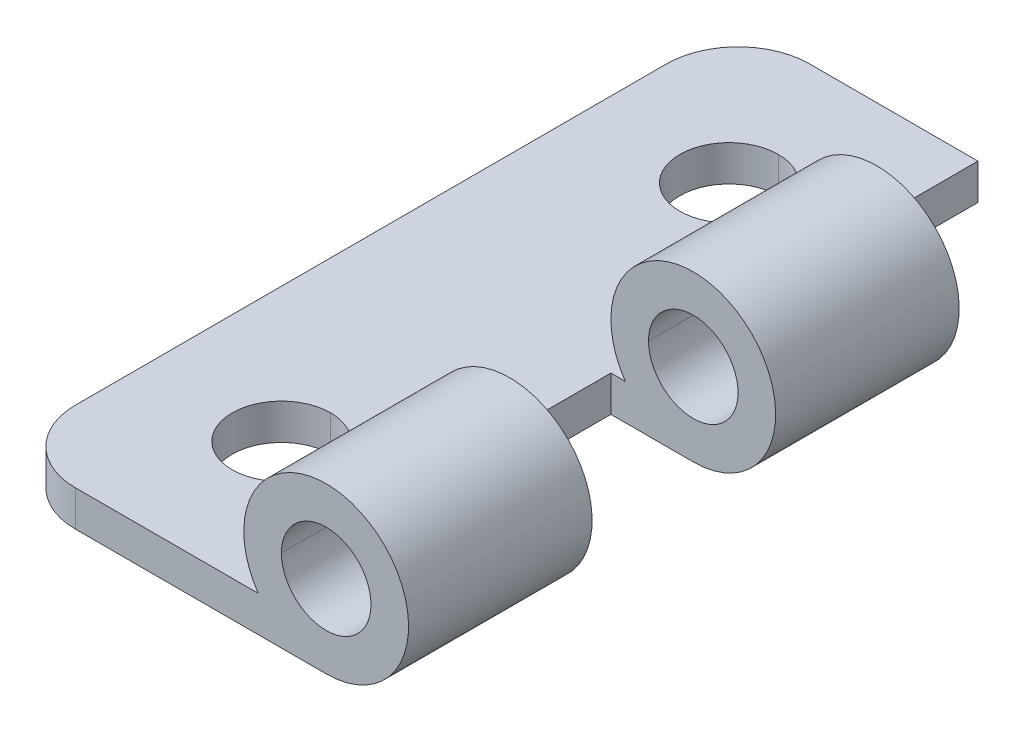
ISO-10303-21;
HEADER;
FILE_DESCRIPTION(('STEP AP214'),'2;1');
FILE_NAME('part.step','',(''),(''),'','','');
FILE_SCHEMA(('AUTOMOTIVE_DESIGN { 1 0 10303 214 1 1 1 1 }'));
ENDSEC;
DATA;
#1=APPLICATION_CONTEXT('core data for automotive mechanical design processes');
#2=APPLICATION_PROTOCOL_DEFINITION('international standard','automotive_design',2000,#1);
#3=PRODUCT_CONTEXT('',#1,'mechanical');
#4=PRODUCT('Part','Part','',(#3));
#5=PRODUCT_RELATED_PRODUCT_CATEGORY('part','',(#4));
#6=PRODUCT_DEFINITION_FORMATION('','',#4);
#7=PRODUCT_DEFINITION_CONTEXT('part definition',#1,'design');
#8=PRODUCT_DEFINITION('design','',#6,#7);
#9=PRODUCT_DEFINITION_SHAPE('','',#8);
#10=(LENGTH_UNIT() NAMED_UNIT(*) SI_UNIT(.MILLI.,.METRE.));
#11=(NAMED_UNIT(*) PLANE_ANGLE_UNIT() SI_UNIT($,.RADIAN.));
#12=(NAMED_UNIT(*) SI_UNIT($,.STERADIAN.) SOLID_ANGLE_UNIT());
#13=UNCERTAINTY_MEASURE_WITH_UNIT(LENGTH_MEASURE(1.E-05),#10,'distance_accuracy_value','');
#14=(GEOMETRIC_REPRESENTATION_CONTEXT(3) GLOBAL_UNCERTAINTY_ASSIGNED_CONTEXT((#13)) GLOBAL_UNIT_ASSIGNED_CONTEXT((#10,
#11,#12)) REPRESENTATION_CONTEXT('',''));
#15=CARTESIAN_POINT('',(0.,0.,0.));
#16=DIRECTION('',(0.,0.,1.));
#17=DIRECTION('',(1.,0.,0.));
#18=AXIS2_PLACEMENT_3D('',#15,#16,#17);
#19=CARTESIAN_POINT('',(-3.7947331922021,-2.6,41.));
#20=DIRECTION('',(0.,-1.,0.));
#21=DIRECTION('',(0.,0.,-1.));
#22=AXIS2_PLACEMENT_3D('',#19,#20,#21);
#23=PLANE('',#22);
#24=CARTESIAN_POINT('',(-10.5,-2.6,8.));
#25=DIRECTION('',(0.,1.,0.));
#26=DIRECTION('',(1.,0.,0.));
#27=AXIS2_PLACEMENT_3D('',#24,#25,#26);
#28=CIRCLE('',#27,2.75);
#29=CARTESIAN_POINT('',(-10.5,-2.6,5.25));
#30=VERTEX_POINT('',#29);
#31=CARTESIAN_POINT('',(-10.5,-2.6,10.75));
#32=VERTEX_POINT('',#31);
#33=EDGE_CURVE('E10',#30,#32,#28,.T.);
#34=ORIENTED_EDGE('',*,*,#33,.F.);
#35=CARTESIAN_POINT('',(-10.5,-2.6,8.));
#36=DIRECTION('',(0.,1.,0.));
#37=DIRECTION('',(0.,0.,1.));
#38=AXIS2_PLACEMENT_3D('',#35,#36,#37);
#39=CIRCLE('',#38,2.75);
#40=EDGE_CURVE('E23',#32,#30,#39,.T.);
#41=ORIENTED_EDGE('',*,*,#40,.F.);
#42=EDGE_LOOP('',(#34,#41));
#43=FACE_BOUND('',#42,.T.);
#44=CARTESIAN_POINT('',(-10.5,-2.6,33.));
#45=DIRECTION('',(0.,1.,0.));
#46=DIRECTION('',(1.,0.,0.));
#47=AXIS2_PLACEMENT_3D('',#44,#45,#46);
#48=CIRCLE('',#47,2.75);
#49=CARTESIAN_POINT('',(-10.5,-2.6,30.25));
#50=VERTEX_POINT('',#49);
#51=CARTESIAN_POINT('',(-10.5,-2.6,35.75));
#52=VERTEX_POINT('',#51);
#53=EDGE_CURVE('E405',#50,#52,#48,.T.);
#54=ORIENTED_EDGE('',*,*,#53,.F.);
#55=CARTESIAN_POINT('',(-10.5,-2.6,33.));
#56=DIRECTION('',(0.,1.,0.));
#57=DIRECTION('',(0.,0.,1.));
#58=AXIS2_PLACEMENT_3D('',#55,#56,#57);
#59=CIRCLE('',#58,2.75);
#60=EDGE_CURVE('E168',#52,#50,#59,.T.);
#61=ORIENTED_EDGE('',*,*,#60,.F.);
#62=EDGE_LOOP('',(#54,#61));
#63=FACE_BOUND('',#62,.T.);
#64=DIRECTION('',(-1.,0.,0.));
#65=VECTOR('',#64,1.);
#66=CARTESIAN_POINT('',(-3.7947331922021,-2.6,20.5));
#67=LINE('',#66,#65);
#68=CARTESIAN_POINT('',(-3.7947331922021,-2.6,20.5));
#69=VERTEX_POINT('',#68);
#70=CARTESIAN_POINT('',(-4.6,-2.6,20.5));
#71=VERTEX_POINT('',#70);
#72=EDGE_CURVE('E397',#69,#71,#67,.T.);
#73=ORIENTED_EDGE('',*,*,#72,.F.);
#74=DIRECTION('',(0.,0.,-1.));
#75=VECTOR('',#74,1.);
#76=CARTESIAN_POINT('',(-3.7947331922021,-2.6,41.));
#77=LINE('',#76,#75);
#78=CARTESIAN_POINT('',(-3.7947331922021,-2.6,10.25));
#79=VERTEX_POINT('',#78);
#80=EDGE_CURVE('E393',#69,#79,#77,.T.);
#81=ORIENTED_EDGE('',*,*,#80,.T.);
#82=DIRECTION('',(-1.,0.,0.));
#83=VECTOR('',#82,1.);
#84=CARTESIAN_POINT('',(-3.7947331922021,-2.6,10.25));
#85=LINE('',#84,#83);
#86=CARTESIAN_POINT('',(-4.6,-2.6,10.25));
#87=VERTEX_POINT('',#86);
#88=EDGE_CURVE('E389',#79,#87,#85,.T.);
#89=ORIENTED_EDGE('',*,*,#88,.T.);
#90=DIRECTION('',(0.,0.,1.));
#91=VECTOR('',#90,1.);
#92=CARTESIAN_POINT('',(-4.6,-2.6,41.));
#93=LINE('',#92,#91);
#94=CARTESIAN_POINT('',(-4.6,-2.6,0.));
#95=VERTEX_POINT('',#94);
#96=EDGE_CURVE('E384',#95,#87,#93,.T.);
#97=ORIENTED_EDGE('',*,*,#96,.F.);
#98=DIRECTION('',(-1.,0.,0.));
#99=VECTOR('',#98,1.);
#100=CARTESIAN_POINT('',(-3.7947331922021,-2.6,0.));
#101=LINE('',#100,#99);
#102=CARTESIAN_POINT('',(-13.9999999999997,-2.6,0.));
#103=VERTEX_POINT('',#102);
#104=EDGE_CURVE('E380',#95,#103,#101,.T.);
#105=ORIENTED_EDGE('',*,*,#104,.T.);
#106=CARTESIAN_POINT('',(-13.9999999999997,-2.6,4.00000000000031));
#107=DIRECTION('',(0.,1.,0.));
#108=DIRECTION('',(1.,0.,0.));
#109=AXIS2_PLACEMENT_3D('',#106,#107,#108);
#110=CIRCLE('',#109,4.00000000000031);
#111=CARTESIAN_POINT('',(-18.,-2.6,4.));
#112=VERTEX_POINT('',#111);
#113=EDGE_CURVE('E376',#103,#112,#110,.T.);
#114=ORIENTED_EDGE('',*,*,#113,.T.);
#115=DIRECTION('',(0.,0.,-1.));
#116=VECTOR('',#115,1.);
#117=CARTESIAN_POINT('',(-18.,-2.6,41.));
#118=LINE('',#117,#116);
#119=CARTESIAN_POINT('',(-18.,-2.6,37.));
#120=VERTEX_POINT('',#119);
#121=EDGE_CURVE('E371',#120,#112,#118,.T.);
#122=ORIENTED_EDGE('',*,*,#121,.F.);
#123=CARTESIAN_POINT('',(-13.9999999999993,-2.6,36.9999999999994));
#124=DIRECTION('',(0.,1.,0.));
#125=DIRECTION('',(1.,0.,0.));
#126=AXIS2_PLACEMENT_3D('',#123,#124,#125);
#127=CIRCLE('',#126,4.00000000000067);
#128=CARTESIAN_POINT('',(-14.,-2.6,41.));
#129=VERTEX_POINT('',#128);
#130=EDGE_CURVE('E367',#120,#129,#127,.T.);
#131=ORIENTED_EDGE('',*,*,#130,.T.);
#132=DIRECTION('',(-1.,0.,0.));
#133=VECTOR('',#132,1.);
#134=CARTESIAN_POINT('',(-3.7947331922021,-2.6,41.));
#135=LINE('',#134,#133);
#136=CARTESIAN_POINT('',(-3.7947331922021,-2.6,41.));
#137=VERTEX_POINT('',#136);
#138=EDGE_CURVE('E362',#137,#129,#135,.T.);
#139=ORIENTED_EDGE('',*,*,#138,.F.);
#140=DIRECTION('',(0.,0.,-1.));
#141=VECTOR('',#140,1.);
#142=CARTESIAN_POINT('',(-3.7947331922021,-2.6,41.));
#143=LINE('',#142,#141);
#144=CARTESIAN_POINT('',(-3.7947331922021,-2.6,30.75));
#145=VERTEX_POINT('',#144);
#146=EDGE_CURVE('E358',#137,#145,#143,.T.);
#147=ORIENTED_EDGE('',*,*,#146,.T.);
#148=DIRECTION('',(-1.,0.,0.));
#149=VECTOR('',#148,1.);
#150=CARTESIAN_POINT('',(-3.7947331922021,-2.6,30.75));
#151=LINE('',#150,#149);
#152=CARTESIAN_POINT('',(-4.6,-2.6,30.75));
#153=VERTEX_POINT('',#152);
#154=EDGE_CURVE('E354',#145,#153,#151,.T.);
#155=ORIENTED_EDGE('',*,*,#154,.T.);
#156=DIRECTION('',(0.,0.,-1.));
#157=VECTOR('',#156,1.);
#158=CARTESIAN_POINT('',(-4.6,-2.6,41.));
#159=LINE('',#158,#157);
#160=EDGE_CURVE('E350',#153,#71,#159,.T.);
#161=ORIENTED_EDGE('',*,*,#160,.T.);
#162=EDGE_LOOP('',(#73,#81,#89,#97,#105,#114,#122,#131,#139,#147,#155,#161));
#163=FACE_BOUND('',#162,.T.);
#164=ADVANCED_FACE('F15',(#43,#63,#163),#23,.F.);
#165=CARTESIAN_POINT('',(-4.6,0.,20.5));
#166=DIRECTION('',(-1.,0.,0.));
#167=DIRECTION('',(0.,0.,1.));
#168=AXIS2_PLACEMENT_3D('',#165,#166,#167);
#169=PLANE('',#168);
#170=DIRECTION('',(0.,-1.,0.));
#171=VECTOR('',#170,1.);
#172=CARTESIAN_POINT('',(-4.6,0.,30.75));
#173=LINE('',#172,#171);
#174=CARTESIAN_POINT('',(-4.6,-4.6,30.75));
#175=VERTEX_POINT('',#174);
#176=EDGE_CURVE('E346',#153,#175,#173,.T.);
#177=ORIENTED_EDGE('',*,*,#176,.T.);
#178=DIRECTION('',(0.,0.,1.));
#179=VECTOR('',#178,1.);
#180=CARTESIAN_POINT('',(-4.6,-4.6,20.5));
#181=LINE('',#180,#179);
#182=CARTESIAN_POINT('',(-4.6,-4.6,20.5));
#183=VERTEX_POINT('',#182);
#184=EDGE_CURVE('E341',#183,#175,#181,.T.);
#185=ORIENTED_EDGE('',*,*,#184,.F.);
#186=DIRECTION('',(0.,-1.,0.));
#187=VECTOR('',#186,1.);
#188=CARTESIAN_POINT('',(-4.6,0.,20.5));
#189=LINE('',#188,#187);
#190=EDGE_CURVE('E336',#71,#183,#189,.T.);
#191=ORIENTED_EDGE('',*,*,#190,.F.);
#192=ORIENTED_EDGE('',*,*,#160,.F.);
#193=EDGE_LOOP('',(#177,#185,#191,#192));
#194=FACE_BOUND('',#193,.T.);
#195=ADVANCED_FACE('F470',(#194),#169,.F.);
#196=CARTESIAN_POINT('',(0.,0.,20.5));
#197=DIRECTION('',(0.,0.,1.));
#198=DIRECTION('',(1.,0.,0.));
#199=AXIS2_PLACEMENT_3D('',#196,#197,#198);
#200=PLANE('',#199);
#201=CARTESIAN_POINT('',(0.,0.,20.5));
#202=DIRECTION('',(0.,0.,1.));
#203=DIRECTION('',(1.,0.,0.));
#204=AXIS2_PLACEMENT_3D('',#201,#202,#203);
#205=CIRCLE('',#204,2.5);
#206=CARTESIAN_POINT('',(-2.5,0.,20.5));
#207=VERTEX_POINT('',#206);
#208=CARTESIAN_POINT('',(2.5,0.,20.5));
#209=VERTEX_POINT('',#208);
#210=EDGE_CURVE('E331',#207,#209,#205,.T.);
#211=ORIENTED_EDGE('',*,*,#210,.F.);
#212=CARTESIAN_POINT('',(0.,0.,20.5));
#213=DIRECTION('',(0.,0.,1.));
#214=DIRECTION('',(1.,0.,0.));
#215=AXIS2_PLACEMENT_3D('',#212,#213,#214);
#216=CIRCLE('',#215,2.5);
#217=EDGE_CURVE('E326',#209,#207,#216,.T.);
#218=ORIENTED_EDGE('',*,*,#217,.F.);
#219=EDGE_LOOP('',(#211,#218));
#220=FACE_BOUND('',#219,.T.);
#221=ORIENTED_EDGE('',*,*,#72,.T.);
#222=ORIENTED_EDGE('',*,*,#190,.T.);
#223=DIRECTION('',(1.,0.,0.));
#224=VECTOR('',#223,1.);
#225=CARTESIAN_POINT('',(-4.6,-4.6,20.5));
#226=LINE('',#225,#224);
#227=CARTESIAN_POINT('',(0.,-4.6,20.5));
#228=VERTEX_POINT('',#227);
#229=EDGE_CURVE('E322',#183,#228,#226,.T.);
#230=ORIENTED_EDGE('',*,*,#229,.T.);
#231=CARTESIAN_POINT('',(0.,0.,20.5));
#232=DIRECTION('',(0.,0.,1.));
#233=DIRECTION('',(1.,0.,0.));
#234=AXIS2_PLACEMENT_3D('',#231,#232,#233);
#235=CIRCLE('',#234,4.6);
#236=EDGE_CURVE('E317',#228,#69,#235,.T.);
#237=ORIENTED_EDGE('',*,*,#236,.T.);
#238=EDGE_LOOP('',(#221,#222,#230,#237));
#239=FACE_BOUND('',#238,.T.);
#240=ADVANCED_FACE('F466',(#220,#239),#200,.T.);
#241=CARTESIAN_POINT('',(0.,0.,41.));
#242=DIRECTION('',(0.,0.,-1.));
#243=DIRECTION('',(-0.46625240116785,-0.884651738485385,0.));
#244=AXIS2_PLACEMENT_3D('',#241,#242,#243);
#245=CYLINDRICAL_SURFACE('',#244,4.6);
#246=ORIENTED_EDGE('',*,*,#236,.F.);
#247=DIRECTION('',(0.,0.,-1.));
#248=VECTOR('',#247,1.);
#249=CARTESIAN_POINT('',(0.,-4.6,41.));
#250=LINE('',#249,#248);
#251=CARTESIAN_POINT('',(0.,-4.6,10.25));
#252=VERTEX_POINT('',#251);
#253=EDGE_CURVE('E313',#228,#252,#250,.T.);
#254=ORIENTED_EDGE('',*,*,#253,.T.);
#255=CARTESIAN_POINT('',(0.,0.,10.25));
#256=DIRECTION('',(0.,0.,1.));
#257=DIRECTION('',(1.,0.,0.));
#258=AXIS2_PLACEMENT_3D('',#255,#256,#257);
#259=CIRCLE('',#258,4.6);
#260=EDGE_CURVE('E308',#252,#79,#259,.T.);
#261=ORIENTED_EDGE('',*,*,#260,.T.);
#262=ORIENTED_EDGE('',*,*,#80,.F.);
#263=EDGE_LOOP('',(#246,#254,#261,#262));
#264=FACE_BOUND('',#263,.T.);
#265=ADVANCED_FACE('F446',(#264),#245,.T.);
#266=CARTESIAN_POINT('',(0.,0.,10.25));
#267=DIRECTION('',(0.,0.,1.));
#268=DIRECTION('',(1.,0.,0.));
#269=AXIS2_PLACEMENT_3D('',#266,#267,#268);
#270=PLANE('',#269);
#271=CARTESIAN_POINT('',(0.,0.,10.25));
#272=DIRECTION('',(0.,0.,1.));
#273=DIRECTION('',(1.,0.,0.));
#274=AXIS2_PLACEMENT_3D('',#271,#272,#273);
#275=CIRCLE('',#274,2.5);
#276=CARTESIAN_POINT('',(2.5,0.,10.25));
#277=VERTEX_POINT('',#276);
#278=CARTESIAN_POINT('',(-2.5,0.,10.25));
#279=VERTEX_POINT('',#278);
#280=EDGE_CURVE('E304',#277,#279,#275,.T.);
#281=ORIENTED_EDGE('',*,*,#280,.T.);
#282=CARTESIAN_POINT('',(0.,0.,10.25));
#283=DIRECTION('',(0.,0.,1.));
#284=DIRECTION('',(1.,0.,0.));
#285=AXIS2_PLACEMENT_3D('',#282,#283,#284);
#286=CIRCLE('',#285,2.5);
#287=EDGE_CURVE('E300',#279,#277,#286,.T.);
#288=ORIENTED_EDGE('',*,*,#287,.T.);
#289=EDGE_LOOP('',(#281,#288));
#290=FACE_BOUND('',#289,.T.);
#291=ORIENTED_EDGE('',*,*,#260,.F.);
#292=DIRECTION('',(1.,0.,0.));
#293=VECTOR('',#292,1.);
#294=CARTESIAN_POINT('',(-4.6,-4.6,10.25));
#295=LINE('',#294,#293);
#296=CARTESIAN_POINT('',(-4.6,-4.6,10.25));
#297=VERTEX_POINT('',#296);
#298=EDGE_CURVE('E295',#297,#252,#295,.T.);
#299=ORIENTED_EDGE('',*,*,#298,.F.);
#300=DIRECTION('',(0.,-1.,0.));
#301=VECTOR('',#300,1.);
#302=CARTESIAN_POINT('',(-4.6,0.,10.25));
#303=LINE('',#302,#301);
#304=EDGE_CURVE('E290',#87,#297,#303,.T.);
#305=ORIENTED_EDGE('',*,*,#304,.F.);
#306=ORIENTED_EDGE('',*,*,#88,.F.);
#307=EDGE_LOOP('',(#291,#299,#305,#306));
#308=FACE_BOUND('',#307,.T.);
#309=ADVANCED_FACE('F442',(#290,#308),#270,.F.);
#310=CARTESIAN_POINT('',(-4.6,0.,10.25));
#311=DIRECTION('',(1.,0.,0.));
#312=DIRECTION('',(0.,0.,-1.));
#313=AXIS2_PLACEMENT_3D('',#310,#311,#312);
#314=PLANE('',#313);
#315=ORIENTED_EDGE('',*,*,#96,.T.);
#316=ORIENTED_EDGE('',*,*,#304,.T.);
#317=DIRECTION('',(0.,0.,-1.));
#318=VECTOR('',#317,1.);
#319=CARTESIAN_POINT('',(-4.6,-4.6,10.25));
#320=LINE('',#319,#318);
#321=CARTESIAN_POINT('',(-4.6,-4.6,0.));
#322=VERTEX_POINT('',#321);
#323=EDGE_CURVE('E286',#297,#322,#320,.T.);
#324=ORIENTED_EDGE('',*,*,#323,.T.);
#325=DIRECTION('',(0.,1.,0.));
#326=VECTOR('',#325,1.);
#327=CARTESIAN_POINT('',(-4.6,0.,0.));
#328=LINE('',#327,#326);
#329=EDGE_CURVE('E281',#322,#95,#328,.T.);
#330=ORIENTED_EDGE('',*,*,#329,.T.);
#331=EDGE_LOOP('',(#315,#316,#324,#330));
#332=FACE_BOUND('',#331,.T.);
#333=ADVANCED_FACE('F445',(#332),#314,.T.);
#334=CARTESIAN_POINT('',(0.,0.,0.));
#335=DIRECTION('',(0.,0.,1.));
#336=DIRECTION('',(1.,0.,0.));
#337=AXIS2_PLACEMENT_3D('',#334,#335,#336);
#338=PLANE('',#337);
#339=ORIENTED_EDGE('',*,*,#329,.F.);
#340=DIRECTION('',(1.,0.,0.));
#341=VECTOR('',#340,1.);
#342=CARTESIAN_POINT('',(-18.,-4.6,0.));
#343=LINE('',#342,#341);
#344=CARTESIAN_POINT('',(-14.,-4.6,0.));
#345=VERTEX_POINT('',#344);
#346=EDGE_CURVE('E276',#345,#322,#343,.T.);
#347=ORIENTED_EDGE('',*,*,#346,.F.);
#348=DIRECTION('',(0.,-1.,0.));
#349=VECTOR('',#348,1.);
#350=CARTESIAN_POINT('',(-14.,-2.6,0.));
#351=LINE('',#350,#349);
#352=EDGE_CURVE('E271',#103,#345,#351,.T.);
#353=ORIENTED_EDGE('',*,*,#352,.F.);
#354=ORIENTED_EDGE('',*,*,#104,.F.);
#355=EDGE_LOOP('',(#339,#347,#353,#354));
#356=FACE_BOUND('',#355,.T.);
#357=ADVANCED_FACE('F496',(#356),#338,.F.);
#358=CARTESIAN_POINT('',(-13.9999999999997,-2.6,4.00000000000031));
#359=DIRECTION('',(0.,-1.,0.));
#360=DIRECTION('',(0.707106781186521,0.,0.707106781186574));
#361=AXIS2_PLACEMENT_3D('',#358,#359,#360);
#362=CYLINDRICAL_SURFACE('',#361,4.00000000000031);
#363=CARTESIAN_POINT('',(-13.9999999999997,-4.6,4.00000000000031));
#364=DIRECTION('',(0.,1.,0.));
#365=DIRECTION('',(1.,0.,0.));
#366=AXIS2_PLACEMENT_3D('',#363,#364,#365);
#367=CIRCLE('',#366,4.00000000000031);
#368=CARTESIAN_POINT('',(-18.,-4.6,4.));
#369=VERTEX_POINT('',#368);
#370=EDGE_CURVE('E267',#345,#369,#367,.T.);
#371=ORIENTED_EDGE('',*,*,#370,.T.);
#372=DIRECTION('',(0.,-1.,0.));
#373=VECTOR('',#372,1.);
#374=CARTESIAN_POINT('',(-18.,-2.6,4.));
#375=LINE('',#374,#373);
#376=EDGE_CURVE('E262',#112,#369,#375,.T.);
#377=ORIENTED_EDGE('',*,*,#376,.F.);
#378=ORIENTED_EDGE('',*,*,#113,.F.);
#379=ORIENTED_EDGE('',*,*,#352,.T.);
#380=EDGE_LOOP('',(#371,#377,#378,#379));
#381=FACE_BOUND('',#380,.T.);
#382=ADVANCED_FACE('F494',(#381),#362,.T.);
#383=CARTESIAN_POINT('',(-18.,-2.6,41.));
#384=DIRECTION('',(1.,0.,0.));
#385=DIRECTION('',(0.,0.,-1.));
#386=AXIS2_PLACEMENT_3D('',#383,#384,#385);
#387=PLANE('',#386);
#388=DIRECTION('',(0.,0.,-1.));
#389=VECTOR('',#388,1.);
#390=CARTESIAN_POINT('',(-18.,-4.6,41.));
#391=LINE('',#390,#389);
#392=CARTESIAN_POINT('',(-18.,-4.6,37.));
#393=VERTEX_POINT('',#392);
#394=EDGE_CURVE('E257',#393,#369,#391,.T.);
#395=ORIENTED_EDGE('',*,*,#394,.F.);
#396=DIRECTION('',(0.,-1.,0.));
#397=VECTOR('',#396,1.);
#398=CARTESIAN_POINT('',(-18.,-2.6,37.));
#399=LINE('',#398,#397);
#400=EDGE_CURVE('E252',#120,#393,#399,.T.);
#401=ORIENTED_EDGE('',*,*,#400,.F.);
#402=ORIENTED_EDGE('',*,*,#121,.T.);
#403=ORIENTED_EDGE('',*,*,#376,.T.);
#404=EDGE_LOOP('',(#395,#401,#402,#403));
#405=FACE_BOUND('',#404,.T.);
#406=ADVANCED_FACE('F490',(#405),#387,.F.);
#407=CARTESIAN_POINT('',(-13.9999999999993,-2.6,36.9999999999994));
#408=DIRECTION('',(0.,-1.,0.));
#409=DIRECTION('',(0.707106781186491,0.,-0.707106781186605));
#410=AXIS2_PLACEMENT_3D('',#407,#408,#409);
#411=CYLINDRICAL_SURFACE('',#410,4.00000000000067);
#412=CARTESIAN_POINT('',(-13.9999999999993,-4.6,36.9999999999994));
#413=DIRECTION('',(0.,1.,0.));
#414=DIRECTION('',(1.,0.,0.));
#415=AXIS2_PLACEMENT_3D('',#412,#413,#414);
#416=CIRCLE('',#415,4.00000000000067);
#417=CARTESIAN_POINT('',(-13.9999999999993,-4.6,41.));
#418=VERTEX_POINT('',#417);
#419=EDGE_CURVE('E248',#393,#418,#416,.T.);
#420=ORIENTED_EDGE('',*,*,#419,.T.);
#421=DIRECTION('',(0.,-1.,0.));
#422=VECTOR('',#421,1.);
#423=CARTESIAN_POINT('',(-14.,-2.6,41.));
#424=LINE('',#423,#422);
#425=EDGE_CURVE('E243',#129,#418,#424,.T.);
#426=ORIENTED_EDGE('',*,*,#425,.F.);
#427=ORIENTED_EDGE('',*,*,#130,.F.);
#428=ORIENTED_EDGE('',*,*,#400,.T.);
#429=EDGE_LOOP('',(#420,#426,#427,#428));
#430=FACE_BOUND('',#429,.T.);
#431=ADVANCED_FACE('F487',(#430),#411,.T.);
#432=CARTESIAN_POINT('',(0.,0.,41.));
#433=DIRECTION('',(0.,0.,1.));
#434=DIRECTION('',(1.,0.,0.));
#435=AXIS2_PLACEMENT_3D('',#432,#433,#434);
#436=PLANE('',#435);
#437=DIRECTION('',(1.,0.,0.));
#438=VECTOR('',#437,1.);
#439=CARTESIAN_POINT('',(-18.,-4.6,41.));
#440=LINE('',#439,#438);
#441=CARTESIAN_POINT('',(0.,-4.6,41.));
#442=VERTEX_POINT('',#441);
#443=EDGE_CURVE('E239',#418,#442,#440,.T.);
#444=ORIENTED_EDGE('',*,*,#443,.T.);
#445=CARTESIAN_POINT('',(0.,0.,41.));
#446=DIRECTION('',(0.,0.,1.));
#447=DIRECTION('',(1.,0.,0.));
#448=AXIS2_PLACEMENT_3D('',#445,#446,#447);
#449=CIRCLE('',#448,4.6);
#450=EDGE_CURVE('E234',#442,#137,#449,.T.);
#451=ORIENTED_EDGE('',*,*,#450,.T.);
#452=ORIENTED_EDGE('',*,*,#138,.T.);
#453=ORIENTED_EDGE('',*,*,#425,.T.);
#454=EDGE_LOOP('',(#444,#451,#452,#453));
#455=FACE_BOUND('',#454,.T.);
#456=CARTESIAN_POINT('',(0.,0.,41.));
#457=DIRECTION('',(0.,0.,1.));
#458=DIRECTION('',(1.,0.,0.));
#459=AXIS2_PLACEMENT_3D('',#456,#457,#458);
#460=CIRCLE('',#459,2.5);
#461=CARTESIAN_POINT('',(-2.5,0.,41.));
#462=VERTEX_POINT('',#461);
#463=CARTESIAN_POINT('',(2.5,0.,41.));
#464=VERTEX_POINT('',#463);
#465=EDGE_CURVE('E229',#462,#464,#460,.T.);
#466=ORIENTED_EDGE('',*,*,#465,.F.);
#467=CARTESIAN_POINT('',(0.,0.,41.));
#468=DIRECTION('',(0.,0.,1.));
#469=DIRECTION('',(1.,0.,0.));
#470=AXIS2_PLACEMENT_3D('',#467,#468,#469);
#471=CIRCLE('',#470,2.5);
#472=EDGE_CURVE('E224',#464,#462,#471,.T.);
#473=ORIENTED_EDGE('',*,*,#472,.F.);
#474=EDGE_LOOP('',(#466,#473));
#475=FACE_BOUND('',#474,.T.);
#476=ADVANCED_FACE('F483',(#455,#475),#436,.T.);
#477=CARTESIAN_POINT('',(0.,0.,41.));
#478=DIRECTION('',(0.,0.,-1.));
#479=DIRECTION('',(0.,-1.,0.));
#480=AXIS2_PLACEMENT_3D('',#477,#478,#479);
#481=CYLINDRICAL_SURFACE('',#480,2.5);
#482=DIRECTION('',(0.,0.,-1.));
#483=VECTOR('',#482,1.);
#484=CARTESIAN_POINT('',(2.5,0.,41.));
#485=LINE('',#484,#483);
#486=CARTESIAN_POINT('',(2.5,0.,30.75));
#487=VERTEX_POINT('',#486);
#488=EDGE_CURVE('E219',#464,#487,#485,.T.);
#489=ORIENTED_EDGE('',*,*,#488,.F.);
#490=ORIENTED_EDGE('',*,*,#472,.T.);
#491=DIRECTION('',(0.,0.,-1.));
#492=VECTOR('',#491,1.);
#493=CARTESIAN_POINT('',(-2.5,0.,41.));
#494=LINE('',#493,#492);
#495=CARTESIAN_POINT('',(-2.5,0.,30.75));
#496=VERTEX_POINT('',#495);
#497=EDGE_CURVE('E215',#462,#496,#494,.T.);
#498=ORIENTED_EDGE('',*,*,#497,.T.);
#499=CARTESIAN_POINT('',(0.,0.,30.75));
#500=DIRECTION('',(0.,0.,1.));
#501=DIRECTION('',(1.,0.,0.));
#502=AXIS2_PLACEMENT_3D('',#499,#500,#501);
#503=CIRCLE('',#502,2.5);
#504=EDGE_CURVE('E210',#487,#496,#503,.T.);
#505=ORIENTED_EDGE('',*,*,#504,.F.);
#506=EDGE_LOOP('',(#489,#490,#498,#505));
#507=FACE_BOUND('',#506,.T.);
#508=ADVANCED_FACE('F570',(#507),#481,.F.);
#509=CARTESIAN_POINT('',(0.,0.,30.75));
#510=DIRECTION('',(0.,0.,1.));
#511=DIRECTION('',(1.,0.,0.));
#512=AXIS2_PLACEMENT_3D('',#509,#510,#511);
#513=PLANE('',#512);
#514=ORIENTED_EDGE('',*,*,#504,.T.);
#515=CARTESIAN_POINT('',(0.,0.,30.75));
#516=DIRECTION('',(0.,0.,1.));
#517=DIRECTION('',(1.,0.,0.));
#518=AXIS2_PLACEMENT_3D('',#515,#516,#517);
#519=CIRCLE('',#518,2.5);
#520=EDGE_CURVE('E205',#496,#487,#519,.T.);
#521=ORIENTED_EDGE('',*,*,#520,.T.);
#522=EDGE_LOOP('',(#514,#521));
#523=FACE_BOUND('',#522,.T.);
#524=CARTESIAN_POINT('',(0.,0.,30.75));
#525=DIRECTION('',(0.,0.,1.));
#526=DIRECTION('',(1.,0.,0.));
#527=AXIS2_PLACEMENT_3D('',#524,#525,#526);
#528=CIRCLE('',#527,4.6);
#529=CARTESIAN_POINT('',(0.,-4.6,30.75));
#530=VERTEX_POINT('',#529);
#531=EDGE_CURVE('E200',#530,#145,#528,.T.);
#532=ORIENTED_EDGE('',*,*,#531,.F.);
#533=DIRECTION('',(1.,0.,0.));
#534=VECTOR('',#533,1.);
#535=CARTESIAN_POINT('',(-4.6,-4.6,30.75));
#536=LINE('',#535,#534);
#537=EDGE_CURVE('E195',#175,#530,#536,.T.);
#538=ORIENTED_EDGE('',*,*,#537,.F.);
#539=ORIENTED_EDGE('',*,*,#176,.F.);
#540=ORIENTED_EDGE('',*,*,#154,.F.);
#541=EDGE_LOOP('',(#532,#538,#539,#540));
#542=FACE_BOUND('',#541,.T.);
#543=ADVANCED_FACE('F474',(#523,#542),#513,.F.);
#544=CARTESIAN_POINT('',(-18.,-4.6,41.));
#545=DIRECTION('',(0.,1.,0.));
#546=DIRECTION('',(0.,0.,1.));
#547=AXIS2_PLACEMENT_3D('',#544,#545,#546);
#548=PLANE('',#547);
#549=CARTESIAN_POINT('',(-10.5,-4.6,8.));
#550=DIRECTION('',(0.,1.,0.));
#551=DIRECTION('',(1.,0.,0.));
#552=AXIS2_PLACEMENT_3D('',#549,#550,#551);
#553=CIRCLE('',#552,2.75);
#554=CARTESIAN_POINT('',(-10.5,-4.6,5.25));
#555=VERTEX_POINT('',#554);
#556=CARTESIAN_POINT('',(-10.5,-4.6,10.75));
#557=VERTEX_POINT('',#556);
#558=EDGE_CURVE('E191',#555,#557,#553,.T.);
#559=ORIENTED_EDGE('',*,*,#558,.T.);
#560=CARTESIAN_POINT('',(-10.5,-4.6,8.));
#561=DIRECTION('',(0.,1.,0.));
#562=DIRECTION('',(0.,0.,1.));
#563=AXIS2_PLACEMENT_3D('',#560,#561,#562);
#564=CIRCLE('',#563,2.75);
#565=EDGE_CURVE('E165',#557,#555,#564,.T.);
#566=ORIENTED_EDGE('',*,*,#565,.T.);
#567=EDGE_LOOP('',(#559,#566));
#568=FACE_BOUND('',#567,.T.);
#569=CARTESIAN_POINT('',(-10.5,-4.6,33.));
#570=DIRECTION('',(0.,1.,0.));
#571=DIRECTION('',(1.,0.,0.));
#572=AXIS2_PLACEMENT_3D('',#569,#570,#571);
#573=CIRCLE('',#572,2.75);
#574=CARTESIAN_POINT('',(-10.5,-4.6,30.25));
#575=VERTEX_POINT('',#574);
#576=CARTESIAN_POINT('',(-10.5,-4.6,35.75));
#577=VERTEX_POINT('',#576);
#578=EDGE_CURVE('E151',#575,#577,#573,.T.);
#579=ORIENTED_EDGE('',*,*,#578,.T.);
#580=CARTESIAN_POINT('',(-10.5,-4.6,33.));
#581=DIRECTION('',(0.,1.,0.));
#582=DIRECTION('',(0.,0.,1.));
#583=AXIS2_PLACEMENT_3D('',#580,#581,#582);
#584=CIRCLE('',#583,2.75);
#585=EDGE_CURVE('E147',#577,#575,#584,.T.);
#586=ORIENTED_EDGE('',*,*,#585,.T.);
#587=EDGE_LOOP('',(#579,#586));
#588=FACE_BOUND('',#587,.T.);
#589=ORIENTED_EDGE('',*,*,#229,.F.);
#590=ORIENTED_EDGE('',*,*,#184,.T.);
#591=ORIENTED_EDGE('',*,*,#537,.T.);
#592=DIRECTION('',(0.,0.,-1.));
#593=VECTOR('',#592,1.);
#594=CARTESIAN_POINT('',(0.,-4.6,41.));
#595=LINE('',#594,#593);
#596=EDGE_CURVE('E156',#442,#530,#595,.T.);
#597=ORIENTED_EDGE('',*,*,#596,.F.);
#598=ORIENTED_EDGE('',*,*,#443,.F.);
#599=ORIENTED_EDGE('',*,*,#419,.F.);
#600=ORIENTED_EDGE('',*,*,#394,.T.);
#601=ORIENTED_EDGE('',*,*,#370,.F.);
#602=ORIENTED_EDGE('',*,*,#346,.T.);
#603=ORIENTED_EDGE('',*,*,#323,.F.);
#604=ORIENTED_EDGE('',*,*,#298,.T.);
#605=ORIENTED_EDGE('',*,*,#253,.F.);
#606=EDGE_LOOP('',(#589,#590,#591,#597,#598,#599,#600,#601,#602,#603,#604,#605));
#607=FACE_BOUND('',#606,.T.);
#608=ADVANCED_FACE('F149',(#568,#588,#607),#548,.F.);
#609=CARTESIAN_POINT('',(0.,0.,41.));
#610=DIRECTION('',(0.,0.,-1.));
#611=DIRECTION('',(-0.46625240116785,-0.884651738485385,0.));
#612=AXIS2_PLACEMENT_3D('',#609,#610,#611);
#613=CYLINDRICAL_SURFACE('',#612,4.6);
#614=ORIENTED_EDGE('',*,*,#596,.T.);
#615=ORIENTED_EDGE('',*,*,#531,.T.);
#616=ORIENTED_EDGE('',*,*,#146,.F.);
#617=ORIENTED_EDGE('',*,*,#450,.F.);
#618=EDGE_LOOP('',(#614,#615,#616,#617));
#619=FACE_BOUND('',#618,.T.);
#620=ADVANCED_FACE('F478',(#619),#613,.T.);
#621=CARTESIAN_POINT('',(-10.5,-2.6,33.));
#622=DIRECTION('',(0.,-1.,0.));
#623=DIRECTION('',(-1.,0.,0.));
#624=AXIS2_PLACEMENT_3D('',#621,#622,#623);
#625=CYLINDRICAL_SURFACE('',#624,2.75);
#626=DIRECTION('',(0.,-1.,0.));
#627=VECTOR('',#626,1.);
#628=CARTESIAN_POINT('',(-10.5,-2.6,35.75));
#629=LINE('',#628,#627);
#630=EDGE_CURVE('E164',#52,#577,#629,.T.);
#631=ORIENTED_EDGE('',*,*,#630,.F.);
#632=ORIENTED_EDGE('',*,*,#60,.T.);
#633=DIRECTION('',(0.,-1.,0.));
#634=VECTOR('',#633,1.);
#635=CARTESIAN_POINT('',(-10.5,-2.6,30.25));
#636=LINE('',#635,#634);
#637=EDGE_CURVE('E162',#50,#575,#636,.T.);
#638=ORIENTED_EDGE('',*,*,#637,.T.);
#639=ORIENTED_EDGE('',*,*,#585,.F.);
#640=EDGE_LOOP('',(#631,#632,#638,#639));
#641=FACE_BOUND('',#640,.T.);
#642=ADVANCED_FACE('F167',(#641),#625,.F.);
#643=CARTESIAN_POINT('',(-10.5,-2.6,33.));
#644=DIRECTION('',(0.,-1.,0.));
#645=DIRECTION('',(1.,0.,0.));
#646=AXIS2_PLACEMENT_3D('',#643,#644,#645);
#647=CYLINDRICAL_SURFACE('',#646,2.75);
#648=ORIENTED_EDGE('',*,*,#630,.T.);
#649=ORIENTED_EDGE('',*,*,#578,.F.);
#650=ORIENTED_EDGE('',*,*,#637,.F.);
#651=ORIENTED_EDGE('',*,*,#53,.T.);
#652=EDGE_LOOP('',(#648,#649,#650,#651));
#653=FACE_BOUND('',#652,.T.);
#654=ADVANCED_FACE('F160',(#653),#647,.F.);
#655=CARTESIAN_POINT('',(-10.5,-2.6,8.));
#656=DIRECTION('',(0.,-1.,0.));
#657=DIRECTION('',(-1.,0.,0.));
#658=AXIS2_PLACEMENT_3D('',#655,#656,#657);
#659=CYLINDRICAL_SURFACE('',#658,2.75);
#660=DIRECTION('',(0.,-1.,0.));
#661=VECTOR('',#660,1.);
#662=CARTESIAN_POINT('',(-10.5,-2.6,10.75));
#663=LINE('',#662,#661);
#664=EDGE_CURVE('E169',#32,#557,#663,.T.);
#665=ORIENTED_EDGE('',*,*,#664,.F.);
#666=ORIENTED_EDGE('',*,*,#40,.T.);
#667=DIRECTION('',(0.,-1.,0.));
#668=VECTOR('',#667,1.);
#669=CARTESIAN_POINT('',(-10.5,-2.6,5.25));
#670=LINE('',#669,#668);
#671=EDGE_CURVE('E173',#30,#555,#670,.T.);
#672=ORIENTED_EDGE('',*,*,#671,.T.);
#673=ORIENTED_EDGE('',*,*,#565,.F.);
#674=EDGE_LOOP('',(#665,#666,#672,#673));
#675=FACE_BOUND('',#674,.T.);
#676=ADVANCED_FACE('F415',(#675),#659,.F.);
#677=CARTESIAN_POINT('',(-10.5,-2.6,8.));
#678=DIRECTION('',(0.,-1.,0.));
#679=DIRECTION('',(1.,0.,0.));
#680=AXIS2_PLACEMENT_3D('',#677,#678,#679);
#681=CYLINDRICAL_SURFACE('',#680,2.75);
#682=ORIENTED_EDGE('',*,*,#664,.T.);
#683=ORIENTED_EDGE('',*,*,#558,.F.);
#684=ORIENTED_EDGE('',*,*,#671,.F.);
#685=ORIENTED_EDGE('',*,*,#33,.T.);
#686=EDGE_LOOP('',(#682,#683,#684,#685));
#687=FACE_BOUND('',#686,.T.);
#688=ADVANCED_FACE('F419',(#687),#681,.F.);
#689=CARTESIAN_POINT('',(0.,0.,41.));
#690=DIRECTION('',(0.,0.,-1.));
#691=DIRECTION('',(0.,1.,0.));
#692=AXIS2_PLACEMENT_3D('',#689,#690,#691);
#693=CYLINDRICAL_SURFACE('',#692,2.5);
#694=ORIENTED_EDGE('',*,*,#488,.T.);
#695=ORIENTED_EDGE('',*,*,#520,.F.);
#696=ORIENTED_EDGE('',*,*,#497,.F.);
#697=ORIENTED_EDGE('',*,*,#465,.T.);
#698=EDGE_LOOP('',(#694,#695,#696,#697));
#699=FACE_BOUND('',#698,.T.);
#700=ADVANCED_FACE('F638',(#699),#693,.F.);
#701=CARTESIAN_POINT('',(0.,0.,41.));
#702=DIRECTION('',(0.,0.,-1.));
#703=DIRECTION('',(0.,1.,0.));
#704=AXIS2_PLACEMENT_3D('',#701,#702,#703);
#705=CYLINDRICAL_SURFACE('',#704,2.5);
#706=DIRECTION('',(0.,0.,-1.));
#707=VECTOR('',#706,1.);
#708=CARTESIAN_POINT('',(2.5,0.,20.5));
#709=LINE('',#708,#707);
#710=EDGE_CURVE('E420',#209,#277,#709,.T.);
#711=ORIENTED_EDGE('',*,*,#710,.T.);
#712=ORIENTED_EDGE('',*,*,#287,.F.);
#713=DIRECTION('',(0.,0.,-1.));
#714=VECTOR('',#713,1.);
#715=CARTESIAN_POINT('',(-2.5,0.,20.5));
#716=LINE('',#715,#714);
#717=EDGE_CURVE('E423',#207,#279,#716,.T.);
#718=ORIENTED_EDGE('',*,*,#717,.F.);
#719=ORIENTED_EDGE('',*,*,#210,.T.);
#720=EDGE_LOOP('',(#711,#712,#718,#719));
#721=FACE_BOUND('',#720,.T.);
#722=ADVANCED_FACE('F440',(#721),#705,.F.);
#723=CARTESIAN_POINT('',(0.,0.,41.));
#724=DIRECTION('',(0.,0.,-1.));
#725=DIRECTION('',(0.,-1.,0.));
#726=AXIS2_PLACEMENT_3D('',#723,#724,#725);
#727=CYLINDRICAL_SURFACE('',#726,2.5);
#728=ORIENTED_EDGE('',*,*,#710,.F.);
#729=ORIENTED_EDGE('',*,*,#217,.T.);
#730=ORIENTED_EDGE('',*,*,#717,.T.);
#731=ORIENTED_EDGE('',*,*,#280,.F.);
#732=EDGE_LOOP('',(#728,#729,#730,#731));
#733=FACE_BOUND('',#732,.T.);
#734=ADVANCED_FACE('F437',(#733),#727,.F.);
#735=CLOSED_SHELL('',(#164,#195,#240,#265,#309,#333,#357,#382,#406,#431,#476,#508,#543,#608,
#620,#642,#654,#676,#688,#700,#722,#734));
#736=MANIFOLD_SOLID_BREP('B1',#735);
#737=ADVANCED_BREP_SHAPE_REPRESENTATION('',(#18,#736),#14);
#738=SHAPE_DEFINITION_REPRESENTATION(#9,#737);
ENDSEC;
END-ISO-10303-21;
